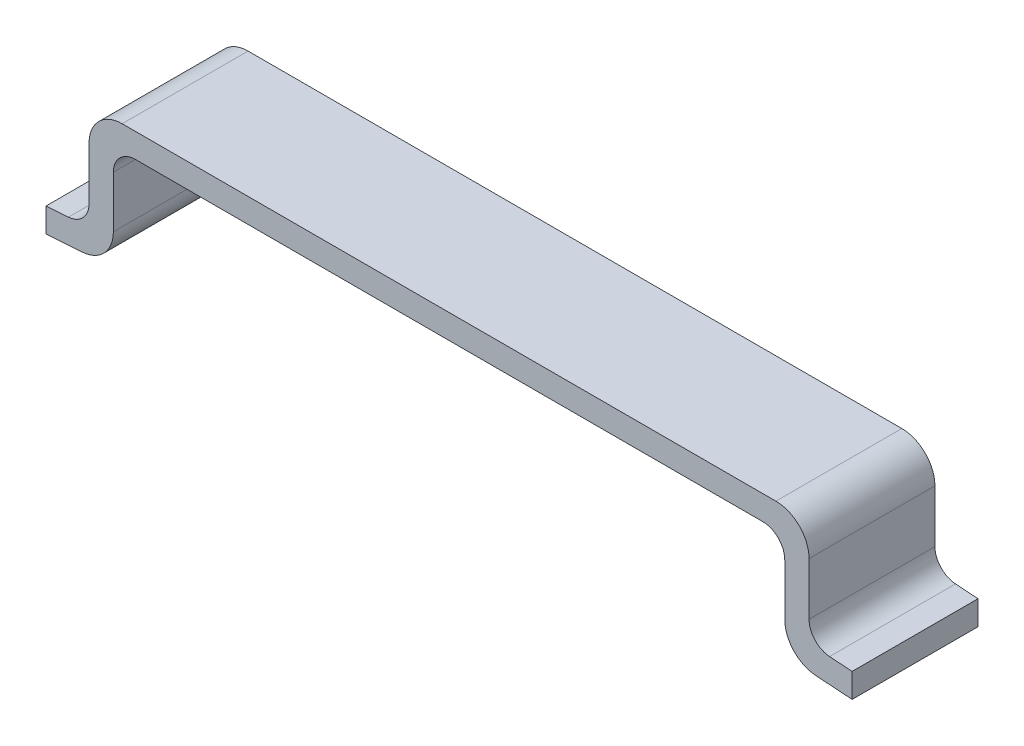
ISO-10303-21;
HEADER;
FILE_DESCRIPTION(('STEP AP214'),'2;1');
FILE_NAME('part.step','',(''),(''),'','','');
FILE_SCHEMA(('AUTOMOTIVE_DESIGN { 1 0 10303 214 1 1 1 1 }'));
ENDSEC;
DATA;
#1=APPLICATION_CONTEXT('core data for automotive mechanical design processes');
#2=APPLICATION_PROTOCOL_DEFINITION('international standard','automotive_design',2000,#1);
#3=PRODUCT_CONTEXT('',#1,'mechanical');
#4=PRODUCT('Part','Part','',(#3));
#5=PRODUCT_RELATED_PRODUCT_CATEGORY('part','',(#4));
#6=PRODUCT_DEFINITION_FORMATION('','',#4);
#7=PRODUCT_DEFINITION_CONTEXT('part definition',#1,'design');
#8=PRODUCT_DEFINITION('design','',#6,#7);
#9=PRODUCT_DEFINITION_SHAPE('','',#8);
#10=(LENGTH_UNIT() NAMED_UNIT(*) SI_UNIT(.MILLI.,.METRE.));
#11=(NAMED_UNIT(*) PLANE_ANGLE_UNIT() SI_UNIT($,.RADIAN.));
#12=(NAMED_UNIT(*) SI_UNIT($,.STERADIAN.) SOLID_ANGLE_UNIT());
#13=UNCERTAINTY_MEASURE_WITH_UNIT(LENGTH_MEASURE(1.E-05),#10,'distance_accuracy_value','');
#14=(GEOMETRIC_REPRESENTATION_CONTEXT(3) GLOBAL_UNCERTAINTY_ASSIGNED_CONTEXT((#13)) GLOBAL_UNIT_ASSIGNED_CONTEXT((#10,
#11,#12)) REPRESENTATION_CONTEXT('',''));
#15=CARTESIAN_POINT('',(0.,0.,0.));
#16=DIRECTION('',(0.,0.,1.));
#17=DIRECTION('',(1.,0.,0.));
#18=AXIS2_PLACEMENT_3D('',#15,#16,#17);
#19=CARTESIAN_POINT('',(1.825,0.,0.));
#20=DIRECTION('',(1.,0.,0.));
#21=DIRECTION('',(0.,1.,0.));
#22=AXIS2_PLACEMENT_3D('',#19,#20,#21);
#23=PLANE('',#22);
#24=DIRECTION('',(0.,0.,1.));
#25=VECTOR('',#24,1.);
#26=CARTESIAN_POINT('',(1.825,0.11,0.));
#27=LINE('',#26,#25);
#28=CARTESIAN_POINT('',(1.825,0.11,-0.285));
#29=VERTEX_POINT('',#28);
#30=CARTESIAN_POINT('',(1.825,0.11,0.285));
#31=VERTEX_POINT('',#30);
#32=EDGE_CURVE('E11',#29,#31,#27,.T.);
#33=ORIENTED_EDGE('',*,*,#32,.T.);
#34=DIRECTION('',(0.,1.,0.));
#35=VECTOR('',#34,1.);
#36=CARTESIAN_POINT('',(1.825,0.,0.285));
#37=LINE('',#36,#35);
#38=CARTESIAN_POINT('',(1.825,0.,0.285));
#39=VERTEX_POINT('',#38);
#40=EDGE_CURVE('E213',#39,#31,#37,.T.);
#41=ORIENTED_EDGE('',*,*,#40,.F.);
#42=DIRECTION('',(0.,0.,-1.));
#43=VECTOR('',#42,1.);
#44=CARTESIAN_POINT('',(1.825,0.,0.));
#45=LINE('',#44,#43);
#46=CARTESIAN_POINT('',(1.825,0.,-0.285));
#47=VERTEX_POINT('',#46);
#48=EDGE_CURVE('E186',#39,#47,#45,.T.);
#49=ORIENTED_EDGE('',*,*,#48,.T.);
#50=DIRECTION('',(0.,-1.,0.));
#51=VECTOR('',#50,1.);
#52=CARTESIAN_POINT('',(1.825,0.,-0.285));
#53=LINE('',#52,#51);
#54=EDGE_CURVE('E184',#29,#47,#53,.T.);
#55=ORIENTED_EDGE('',*,*,#54,.F.);
#56=EDGE_LOOP('',(#33,#41,#49,#55));
#57=FACE_BOUND('',#56,.T.);
#58=ADVANCED_FACE('F17',(#57),#23,.T.);
#59=CARTESIAN_POINT('',(1.825,0.11,0.));
#60=DIRECTION('',(0.0697564737441177,0.997564050259825,0.));
#61=DIRECTION('',(0.,0.,-1.));
#62=AXIS2_PLACEMENT_3D('',#59,#60,#61);
#63=PLANE('',#62);
#64=DIRECTION('',(0.,0.,-1.));
#65=VECTOR('',#64,1.);
#66=CARTESIAN_POINT('',(1.723024352626,0.117130831917,0.));
#67=LINE('',#66,#65);
#68=CARTESIAN_POINT('',(1.723024352626,0.117130831917,0.285));
#69=VERTEX_POINT('',#68);
#70=CARTESIAN_POINT('',(1.723024352626,0.117130831917,-0.285));
#71=VERTEX_POINT('',#70);
#72=EDGE_CURVE('E273',#69,#71,#67,.T.);
#73=ORIENTED_EDGE('',*,*,#72,.F.);
#74=DIRECTION('',(-0.997564050259825,0.0697564737441177,0.));
#75=VECTOR('',#74,1.);
#76=CARTESIAN_POINT('',(1.825,0.11,0.285));
#77=LINE('',#76,#75);
#78=EDGE_CURVE('E181',#31,#69,#77,.T.);
#79=ORIENTED_EDGE('',*,*,#78,.F.);
#80=ORIENTED_EDGE('',*,*,#32,.F.);
#81=DIRECTION('',(0.997564050259825,-0.0697564737441177,0.));
#82=VECTOR('',#81,1.);
#83=CARTESIAN_POINT('',(1.825,0.11,-0.285));
#84=LINE('',#83,#82);
#85=EDGE_CURVE('E179',#71,#29,#84,.T.);
#86=ORIENTED_EDGE('',*,*,#85,.F.);
#87=EDGE_LOOP('',(#73,#79,#80,#86));
#88=FACE_BOUND('',#87,.T.);
#89=ADVANCED_FACE('F19',(#88),#63,.T.);
#90=CARTESIAN_POINT('',(1.52,0.605,0.));
#91=DIRECTION('',(-1.,0.,0.));
#92=DIRECTION('',(0.,0.,1.));
#93=AXIS2_PLACEMENT_3D('',#90,#91,#92);
#94=PLANE('',#93);
#95=DIRECTION('',(0.,0.,1.));
#96=VECTOR('',#95,1.);
#97=CARTESIAN_POINT('',(1.52,0.395,0.));
#98=LINE('',#97,#96);
#99=CARTESIAN_POINT('',(1.52,0.395,-0.285));
#100=VERTEX_POINT('',#99);
#101=CARTESIAN_POINT('',(1.52,0.395,0.285));
#102=VERTEX_POINT('',#101);
#103=EDGE_CURVE('E248',#100,#102,#98,.T.);
#104=ORIENTED_EDGE('',*,*,#103,.F.);
#105=DIRECTION('',(0.,1.,0.));
#106=VECTOR('',#105,1.);
#107=CARTESIAN_POINT('',(1.52,0.605,-0.285));
#108=LINE('',#107,#106);
#109=CARTESIAN_POINT('',(1.52,0.161204940563,-0.285));
#110=VERTEX_POINT('',#109);
#111=EDGE_CURVE('E379',#110,#100,#108,.T.);
#112=ORIENTED_EDGE('',*,*,#111,.F.);
#113=DIRECTION('',(0.,0.,-1.));
#114=VECTOR('',#113,1.);
#115=CARTESIAN_POINT('',(1.52,0.161204940563,0.));
#116=LINE('',#115,#114);
#117=CARTESIAN_POINT('',(1.52,0.161204940563,0.285));
#118=VERTEX_POINT('',#117);
#119=EDGE_CURVE('E292',#118,#110,#116,.T.);
#120=ORIENTED_EDGE('',*,*,#119,.F.);
#121=DIRECTION('',(0.,-1.,0.));
#122=VECTOR('',#121,1.);
#123=CARTESIAN_POINT('',(1.52,0.605,0.285));
#124=LINE('',#123,#122);
#125=EDGE_CURVE('E27',#102,#118,#124,.T.);
#126=ORIENTED_EDGE('',*,*,#125,.F.);
#127=EDGE_LOOP('',(#104,#112,#120,#126));
#128=FACE_BOUND('',#127,.T.);
#129=ADVANCED_FACE('F747',(#128),#94,.T.);
#130=CARTESIAN_POINT('',(1.575,0.605,0.));
#131=DIRECTION('',(0.,1.,0.));
#132=DIRECTION('',(1.,0.,0.));
#133=AXIS2_PLACEMENT_3D('',#130,#131,#132);
#134=PLANE('',#133);
#135=DIRECTION('',(0.,0.,1.));
#136=VECTOR('',#135,1.);
#137=CARTESIAN_POINT('',(1.48,0.605,0.));
#138=LINE('',#137,#136);
#139=CARTESIAN_POINT('',(1.48,0.605,-0.285));
#140=VERTEX_POINT('',#139);
#141=CARTESIAN_POINT('',(1.48,0.605,0.285));
#142=VERTEX_POINT('',#141);
#143=EDGE_CURVE('E209',#140,#142,#138,.T.);
#144=ORIENTED_EDGE('',*,*,#143,.F.);
#145=DIRECTION('',(-1.,0.,0.));
#146=VECTOR('',#145,1.);
#147=CARTESIAN_POINT('',(-1.63,0.605,-0.285));
#148=LINE('',#147,#146);
#149=CARTESIAN_POINT('',(-1.48,0.605,-0.285));
#150=VERTEX_POINT('',#149);
#151=EDGE_CURVE('E205',#140,#150,#148,.T.);
#152=ORIENTED_EDGE('',*,*,#151,.T.);
#153=DIRECTION('',(0.,0.,1.));
#154=VECTOR('',#153,1.);
#155=CARTESIAN_POINT('',(-1.48,0.605,0.));
#156=LINE('',#155,#154);
#157=CARTESIAN_POINT('',(-1.48,0.605,0.285));
#158=VERTEX_POINT('',#157);
#159=EDGE_CURVE('E304',#150,#158,#156,.T.);
#160=ORIENTED_EDGE('',*,*,#159,.T.);
#161=DIRECTION('',(-1.,0.,0.));
#162=VECTOR('',#161,1.);
#163=CARTESIAN_POINT('',(1.63,0.605,0.285));
#164=LINE('',#163,#162);
#165=EDGE_CURVE('E216',#142,#158,#164,.T.);
#166=ORIENTED_EDGE('',*,*,#165,.F.);
#167=EDGE_LOOP('',(#144,#152,#160,#166));
#168=FACE_BOUND('',#167,.T.);
#169=ADVANCED_FACE('F386',(#168),#134,.T.);
#170=CARTESIAN_POINT('',(0.7875,0.55,0.285));
#171=DIRECTION('',(0.,0.,1.));
#172=DIRECTION('',(1.,0.,0.));
#173=AXIS2_PLACEMENT_3D('',#170,#171,#172);
#174=PLANE('',#173);
#175=CARTESIAN_POINT('',(1.67,0.161204940563,0.285));
#176=DIRECTION('',(0.,0.,-1.));
#177=DIRECTION('',(-0.73135370161934,-0.681998360062317,0.));
#178=AXIS2_PLACEMENT_3D('',#175,#176,#177);
#179=CIRCLE('',#178,0.15);
#180=CARTESIAN_POINT('',(1.659536528938,0.01157033302445,0.285));
#181=VERTEX_POINT('',#180);
#182=EDGE_CURVE('E288',#181,#118,#179,.T.);
#183=ORIENTED_EDGE('',*,*,#182,.F.);
#184=DIRECTION('',(0.997564050259825,-0.0697564737441177,0.));
#185=VECTOR('',#184,1.);
#186=CARTESIAN_POINT('',(1.52,0.02132767764277,0.285));
#187=LINE('',#186,#185);
#188=EDGE_CURVE('E375',#181,#39,#187,.T.);
#189=ORIENTED_EDGE('',*,*,#188,.T.);
#190=ORIENTED_EDGE('',*,*,#40,.T.);
#191=ORIENTED_EDGE('',*,*,#78,.T.);
#192=CARTESIAN_POINT('',(1.73,0.216887236943,0.285));
#193=DIRECTION('',(0.,0.,1.));
#194=DIRECTION('',(-0.73135370161934,-0.681998360062317,0.));
#195=AXIS2_PLACEMENT_3D('',#192,#193,#194);
#196=CIRCLE('',#195,0.1);
#197=CARTESIAN_POINT('',(1.63,0.216887236943,0.285));
#198=VERTEX_POINT('',#197);
#199=EDGE_CURVE('E277',#198,#69,#196,.T.);
#200=ORIENTED_EDGE('',*,*,#199,.F.);
#201=DIRECTION('',(0.,1.,0.));
#202=VECTOR('',#201,1.);
#203=CARTESIAN_POINT('',(1.63,0.123635728329,0.285));
#204=LINE('',#203,#202);
#205=CARTESIAN_POINT('',(1.63,0.455,0.285));
#206=VERTEX_POINT('',#205);
#207=EDGE_CURVE('E233',#198,#206,#204,.T.);
#208=ORIENTED_EDGE('',*,*,#207,.T.);
#209=CARTESIAN_POINT('',(1.48,0.455,0.285));
#210=DIRECTION('',(0.,0.,-1.));
#211=DIRECTION('',(0.707106781186548,0.707106781186548,0.));
#212=AXIS2_PLACEMENT_3D('',#209,#210,#211);
#213=CIRCLE('',#212,0.15);
#214=EDGE_CURVE('E190',#142,#206,#213,.T.);
#215=ORIENTED_EDGE('',*,*,#214,.F.);
#216=ORIENTED_EDGE('',*,*,#165,.T.);
#217=CARTESIAN_POINT('',(-1.48,0.455,0.285));
#218=DIRECTION('',(0.,0.,1.));
#219=DIRECTION('',(-0.707106781186548,0.707106781186548,0.));
#220=AXIS2_PLACEMENT_3D('',#217,#218,#219);
#221=CIRCLE('',#220,0.15);
#222=CARTESIAN_POINT('',(-1.63,0.455,0.285));
#223=VERTEX_POINT('',#222);
#224=EDGE_CURVE('E301',#158,#223,#221,.T.);
#225=ORIENTED_EDGE('',*,*,#224,.T.);
#226=DIRECTION('',(0.,1.,0.));
#227=VECTOR('',#226,1.);
#228=CARTESIAN_POINT('',(-1.63,0.123635728329,0.285));
#229=LINE('',#228,#227);
#230=CARTESIAN_POINT('',(-1.63,0.216887236943,0.285));
#231=VERTEX_POINT('',#230);
#232=EDGE_CURVE('E401',#231,#223,#229,.T.);
#233=ORIENTED_EDGE('',*,*,#232,.F.);
#234=CARTESIAN_POINT('',(-1.73,0.216887236943,0.285));
#235=DIRECTION('',(0.,0.,-1.));
#236=DIRECTION('',(0.73135370161934,-0.681998360062317,0.));
#237=AXIS2_PLACEMENT_3D('',#234,#235,#236);
#238=CIRCLE('',#237,0.1);
#239=CARTESIAN_POINT('',(-1.723024352626,0.117130831917,0.285));
#240=VERTEX_POINT('',#239);
#241=EDGE_CURVE('E405',#231,#240,#238,.T.);
#242=ORIENTED_EDGE('',*,*,#241,.T.);
#243=DIRECTION('',(0.997564050259825,0.0697564737441177,0.));
#244=VECTOR('',#243,1.);
#245=CARTESIAN_POINT('',(-1.825,0.11,0.285));
#246=LINE('',#245,#244);
#247=CARTESIAN_POINT('',(-1.825,0.11,0.285));
#248=VERTEX_POINT('',#247);
#249=EDGE_CURVE('E332',#248,#240,#246,.T.);
#250=ORIENTED_EDGE('',*,*,#249,.F.);
#251=DIRECTION('',(0.,1.,0.));
#252=VECTOR('',#251,1.);
#253=CARTESIAN_POINT('',(-1.825,0.,0.285));
#254=LINE('',#253,#252);
#255=CARTESIAN_POINT('',(-1.825,0.,0.285));
#256=VERTEX_POINT('',#255);
#257=EDGE_CURVE('E338',#256,#248,#254,.T.);
#258=ORIENTED_EDGE('',*,*,#257,.F.);
#259=DIRECTION('',(-0.997564050259825,-0.0697564737441177,0.));
#260=VECTOR('',#259,1.);
#261=CARTESIAN_POINT('',(-1.52,0.02132767764277,0.285));
#262=LINE('',#261,#260);
#263=CARTESIAN_POINT('',(-1.659536528938,0.01157033302445,0.285));
#264=VERTEX_POINT('',#263);
#265=EDGE_CURVE('E257',#264,#256,#262,.T.);
#266=ORIENTED_EDGE('',*,*,#265,.F.);
#267=CARTESIAN_POINT('',(-1.67,0.161204940563,0.285));
#268=DIRECTION('',(0.,0.,1.));
#269=DIRECTION('',(0.73135370161934,-0.681998360062317,0.));
#270=AXIS2_PLACEMENT_3D('',#267,#268,#269);
#271=CIRCLE('',#270,0.15);
#272=CARTESIAN_POINT('',(-1.52,0.161204940563,0.285));
#273=VERTEX_POINT('',#272);
#274=EDGE_CURVE('E263',#264,#273,#271,.T.);
#275=ORIENTED_EDGE('',*,*,#274,.T.);
#276=DIRECTION('',(0.,-1.,0.));
#277=VECTOR('',#276,1.);
#278=CARTESIAN_POINT('',(-1.52,0.605,0.285));
#279=LINE('',#278,#277);
#280=CARTESIAN_POINT('',(-1.52,0.395,0.285));
#281=VERTEX_POINT('',#280);
#282=EDGE_CURVE('E311',#281,#273,#279,.T.);
#283=ORIENTED_EDGE('',*,*,#282,.F.);
#284=CARTESIAN_POINT('',(-1.42,0.395,0.285));
#285=DIRECTION('',(0.,0.,-1.));
#286=DIRECTION('',(-0.707106781186548,0.707106781186548,0.));
#287=AXIS2_PLACEMENT_3D('',#284,#285,#286);
#288=CIRCLE('',#287,0.1);
#289=CARTESIAN_POINT('',(-1.42,0.495,0.285));
#290=VERTEX_POINT('',#289);
#291=EDGE_CURVE('E239',#281,#290,#288,.T.);
#292=ORIENTED_EDGE('',*,*,#291,.T.);
#293=DIRECTION('',(-1.,0.,0.));
#294=VECTOR('',#293,1.);
#295=CARTESIAN_POINT('',(0.,0.495,0.285));
#296=LINE('',#295,#294);
#297=CARTESIAN_POINT('',(1.42,0.495,0.285));
#298=VERTEX_POINT('',#297);
#299=EDGE_CURVE('E244',#298,#290,#296,.T.);
#300=ORIENTED_EDGE('',*,*,#299,.F.);
#301=CARTESIAN_POINT('',(1.42,0.395,0.285));
#302=DIRECTION('',(0.,0.,1.));
#303=DIRECTION('',(0.707106781186548,0.707106781186548,0.));
#304=AXIS2_PLACEMENT_3D('',#301,#302,#303);
#305=CIRCLE('',#304,0.1);
#306=EDGE_CURVE('E237',#102,#298,#305,.T.);
#307=ORIENTED_EDGE('',*,*,#306,.F.);
#308=ORIENTED_EDGE('',*,*,#125,.T.);
#309=EDGE_LOOP('',(#183,#189,#190,#191,#200,#208,#215,#216,#225,#233,#242,#250,#258,#266,#275,
#283,#292,#300,#307,#308));
#310=FACE_BOUND('',#309,.T.);
#311=ADVANCED_FACE('F399',(#310),#174,.T.);
#312=CARTESIAN_POINT('',(1.48,0.455,0.));
#313=DIRECTION('',(0.,0.,1.));
#314=DIRECTION('',(0.707106781186548,0.707106781186548,0.));
#315=AXIS2_PLACEMENT_3D('',#312,#313,#314);
#316=CYLINDRICAL_SURFACE('',#315,0.15);
#317=ORIENTED_EDGE('',*,*,#214,.T.);
#318=DIRECTION('',(0.,0.,-1.));
#319=VECTOR('',#318,1.);
#320=CARTESIAN_POINT('',(1.63,0.455,0.));
#321=LINE('',#320,#319);
#322=CARTESIAN_POINT('',(1.63,0.455,-0.285));
#323=VERTEX_POINT('',#322);
#324=EDGE_CURVE('E238',#206,#323,#321,.T.);
#325=ORIENTED_EDGE('',*,*,#324,.T.);
#326=CARTESIAN_POINT('',(1.48,0.455,-0.285));
#327=DIRECTION('',(0.,0.,1.));
#328=DIRECTION('',(0.707106781186548,0.707106781186548,0.));
#329=AXIS2_PLACEMENT_3D('',#326,#327,#328);
#330=CIRCLE('',#329,0.15);
#331=EDGE_CURVE('E198',#323,#140,#330,.T.);
#332=ORIENTED_EDGE('',*,*,#331,.T.);
#333=ORIENTED_EDGE('',*,*,#143,.T.);
#334=EDGE_LOOP('',(#317,#325,#332,#333));
#335=FACE_BOUND('',#334,.T.);
#336=ADVANCED_FACE('F701',(#335),#316,.T.);
#337=CARTESIAN_POINT('',(0.7875,0.55,-0.285));
#338=DIRECTION('',(0.,0.,-1.));
#339=DIRECTION('',(0.,-1.,0.));
#340=AXIS2_PLACEMENT_3D('',#337,#338,#339);
#341=PLANE('',#340);
#342=CARTESIAN_POINT('',(1.67,0.161204940563,-0.285));
#343=DIRECTION('',(0.,0.,1.));
#344=DIRECTION('',(-0.73135370161934,-0.681998360062317,0.));
#345=AXIS2_PLACEMENT_3D('',#342,#343,#344);
#346=CIRCLE('',#345,0.15);
#347=CARTESIAN_POINT('',(1.659536528938,0.01157033302445,-0.285));
#348=VERTEX_POINT('',#347);
#349=EDGE_CURVE('E324',#110,#348,#346,.T.);
#350=ORIENTED_EDGE('',*,*,#349,.F.);
#351=ORIENTED_EDGE('',*,*,#111,.T.);
#352=CARTESIAN_POINT('',(1.42,0.395,-0.285));
#353=DIRECTION('',(0.,0.,-1.));
#354=DIRECTION('',(0.707106781186548,0.707106781186548,0.));
#355=AXIS2_PLACEMENT_3D('',#352,#353,#354);
#356=CIRCLE('',#355,0.1);
#357=CARTESIAN_POINT('',(1.42,0.495,-0.285));
#358=VERTEX_POINT('',#357);
#359=EDGE_CURVE('E358',#358,#100,#356,.T.);
#360=ORIENTED_EDGE('',*,*,#359,.F.);
#361=DIRECTION('',(-1.,0.,0.));
#362=VECTOR('',#361,1.);
#363=CARTESIAN_POINT('',(0.,0.495,-0.285));
#364=LINE('',#363,#362);
#365=CARTESIAN_POINT('',(-1.42,0.495,-0.285));
#366=VERTEX_POINT('',#365);
#367=EDGE_CURVE('E247',#358,#366,#364,.T.);
#368=ORIENTED_EDGE('',*,*,#367,.T.);
#369=CARTESIAN_POINT('',(-1.42,0.395,-0.285));
#370=DIRECTION('',(0.,0.,1.));
#371=DIRECTION('',(-0.707106781186548,0.707106781186548,0.));
#372=AXIS2_PLACEMENT_3D('',#369,#370,#371);
#373=CIRCLE('',#372,0.1);
#374=CARTESIAN_POINT('',(-1.52,0.395,-0.285));
#375=VERTEX_POINT('',#374);
#376=EDGE_CURVE('E252',#366,#375,#373,.T.);
#377=ORIENTED_EDGE('',*,*,#376,.T.);
#378=DIRECTION('',(0.,1.,0.));
#379=VECTOR('',#378,1.);
#380=CARTESIAN_POINT('',(-1.52,0.605,-0.285));
#381=LINE('',#380,#379);
#382=CARTESIAN_POINT('',(-1.52,0.161204940563,-0.285));
#383=VERTEX_POINT('',#382);
#384=EDGE_CURVE('E314',#383,#375,#381,.T.);
#385=ORIENTED_EDGE('',*,*,#384,.F.);
#386=CARTESIAN_POINT('',(-1.67,0.161204940563,-0.285));
#387=DIRECTION('',(0.,0.,-1.));
#388=DIRECTION('',(0.73135370161934,-0.681998360062317,0.));
#389=AXIS2_PLACEMENT_3D('',#386,#387,#388);
#390=CIRCLE('',#389,0.15);
#391=CARTESIAN_POINT('',(-1.659536528938,0.01157033302445,-0.285));
#392=VERTEX_POINT('',#391);
#393=EDGE_CURVE('E258',#383,#392,#390,.T.);
#394=ORIENTED_EDGE('',*,*,#393,.T.);
#395=DIRECTION('',(0.997564050259825,0.0697564737441177,0.));
#396=VECTOR('',#395,1.);
#397=CARTESIAN_POINT('',(-1.52,0.02132767764277,-0.285));
#398=LINE('',#397,#396);
#399=CARTESIAN_POINT('',(-1.825,0.,-0.285));
#400=VERTEX_POINT('',#399);
#401=EDGE_CURVE('E297',#400,#392,#398,.T.);
#402=ORIENTED_EDGE('',*,*,#401,.F.);
#403=DIRECTION('',(0.,-1.,0.));
#404=VECTOR('',#403,1.);
#405=CARTESIAN_POINT('',(-1.825,0.,-0.285));
#406=LINE('',#405,#404);
#407=CARTESIAN_POINT('',(-1.825,0.11,-0.285));
#408=VERTEX_POINT('',#407);
#409=EDGE_CURVE('E335',#408,#400,#406,.T.);
#410=ORIENTED_EDGE('',*,*,#409,.F.);
#411=DIRECTION('',(-0.997564050259825,-0.0697564737441177,0.));
#412=VECTOR('',#411,1.);
#413=CARTESIAN_POINT('',(-1.825,0.11,-0.285));
#414=LINE('',#413,#412);
#415=CARTESIAN_POINT('',(-1.723024352626,0.117130831917,-0.285));
#416=VERTEX_POINT('',#415);
#417=EDGE_CURVE('E318',#416,#408,#414,.T.);
#418=ORIENTED_EDGE('',*,*,#417,.F.);
#419=CARTESIAN_POINT('',(-1.73,0.216887236943,-0.285));
#420=DIRECTION('',(0.,0.,1.));
#421=DIRECTION('',(0.73135370161934,-0.681998360062317,0.));
#422=AXIS2_PLACEMENT_3D('',#419,#420,#421);
#423=CIRCLE('',#422,0.1);
#424=CARTESIAN_POINT('',(-1.63,0.216887236943,-0.285));
#425=VERTEX_POINT('',#424);
#426=EDGE_CURVE('E425',#416,#425,#423,.T.);
#427=ORIENTED_EDGE('',*,*,#426,.T.);
#428=DIRECTION('',(0.,-1.,0.));
#429=VECTOR('',#428,1.);
#430=CARTESIAN_POINT('',(-1.63,0.123635728329,-0.285));
#431=LINE('',#430,#429);
#432=CARTESIAN_POINT('',(-1.63,0.455,-0.285));
#433=VERTEX_POINT('',#432);
#434=EDGE_CURVE('E231',#433,#425,#431,.T.);
#435=ORIENTED_EDGE('',*,*,#434,.F.);
#436=CARTESIAN_POINT('',(-1.48,0.455,-0.285));
#437=DIRECTION('',(0.,0.,-1.));
#438=DIRECTION('',(-0.707106781186548,0.707106781186548,0.));
#439=AXIS2_PLACEMENT_3D('',#436,#437,#438);
#440=CIRCLE('',#439,0.15);
#441=EDGE_CURVE('E307',#433,#150,#440,.T.);
#442=ORIENTED_EDGE('',*,*,#441,.T.);
#443=ORIENTED_EDGE('',*,*,#151,.F.);
#444=ORIENTED_EDGE('',*,*,#331,.F.);
#445=DIRECTION('',(0.,-1.,0.));
#446=VECTOR('',#445,1.);
#447=CARTESIAN_POINT('',(1.63,0.123635728329,-0.285));
#448=LINE('',#447,#446);
#449=CARTESIAN_POINT('',(1.63,0.216887236943,-0.285));
#450=VERTEX_POINT('',#449);
#451=EDGE_CURVE('E276',#323,#450,#448,.T.);
#452=ORIENTED_EDGE('',*,*,#451,.T.);
#453=CARTESIAN_POINT('',(1.73,0.216887236943,-0.285));
#454=DIRECTION('',(0.,0.,-1.));
#455=DIRECTION('',(-0.73135370161934,-0.681998360062317,0.));
#456=AXIS2_PLACEMENT_3D('',#453,#454,#455);
#457=CIRCLE('',#456,0.1);
#458=EDGE_CURVE('E196',#71,#450,#457,.T.);
#459=ORIENTED_EDGE('',*,*,#458,.F.);
#460=ORIENTED_EDGE('',*,*,#85,.T.);
#461=ORIENTED_EDGE('',*,*,#54,.T.);
#462=DIRECTION('',(-0.997564050259825,0.0697564737441177,0.));
#463=VECTOR('',#462,1.);
#464=CARTESIAN_POINT('',(1.52,0.02132767764277,-0.285));
#465=LINE('',#464,#463);
#466=EDGE_CURVE('E323',#47,#348,#465,.T.);
#467=ORIENTED_EDGE('',*,*,#466,.T.);
#468=EDGE_LOOP('',(#350,#351,#360,#368,#377,#385,#394,#402,#410,#418,#427,#435,#442,#443,#444,
#452,#459,#460,#461,#467));
#469=FACE_BOUND('',#468,.T.);
#470=ADVANCED_FACE('F194',(#469),#341,.T.);
#471=CARTESIAN_POINT('',(1.52,0.02132767764277,0.));
#472=DIRECTION('',(-0.0697564737441177,-0.997564050259825,0.));
#473=DIRECTION('',(-0.997564050259825,0.0697564737441177,0.));
#474=AXIS2_PLACEMENT_3D('',#471,#472,#473);
#475=PLANE('',#474);
#476=DIRECTION('',(0.,0.,1.));
#477=VECTOR('',#476,1.);
#478=CARTESIAN_POINT('',(1.659536528938,0.01157033302445,0.));
#479=LINE('',#478,#477);
#480=EDGE_CURVE('E319',#348,#181,#479,.T.);
#481=ORIENTED_EDGE('',*,*,#480,.F.);
#482=ORIENTED_EDGE('',*,*,#466,.F.);
#483=ORIENTED_EDGE('',*,*,#48,.F.);
#484=ORIENTED_EDGE('',*,*,#188,.F.);
#485=EDGE_LOOP('',(#481,#482,#483,#484));
#486=FACE_BOUND('',#485,.T.);
#487=ADVANCED_FACE('F677',(#486),#475,.T.);
#488=CARTESIAN_POINT('',(1.67,0.161204940563,0.));
#489=DIRECTION('',(0.,0.,1.));
#490=DIRECTION('',(-0.73135370161934,-0.681998360062317,0.));
#491=AXIS2_PLACEMENT_3D('',#488,#489,#490);
#492=CYLINDRICAL_SURFACE('',#491,0.15);
#493=ORIENTED_EDGE('',*,*,#182,.T.);
#494=ORIENTED_EDGE('',*,*,#119,.T.);
#495=ORIENTED_EDGE('',*,*,#349,.T.);
#496=ORIENTED_EDGE('',*,*,#480,.T.);
#497=EDGE_LOOP('',(#493,#494,#495,#496));
#498=FACE_BOUND('',#497,.T.);
#499=ADVANCED_FACE('F682',(#498),#492,.T.);
#500=CARTESIAN_POINT('',(0.,0.495,0.));
#501=DIRECTION('',(0.,-1.,0.));
#502=DIRECTION('',(0.,0.,-1.));
#503=AXIS2_PLACEMENT_3D('',#500,#501,#502);
#504=PLANE('',#503);
#505=DIRECTION('',(0.,0.,-1.));
#506=VECTOR('',#505,1.);
#507=CARTESIAN_POINT('',(1.42,0.495,0.));
#508=LINE('',#507,#506);
#509=EDGE_CURVE('E349',#298,#358,#508,.T.);
#510=ORIENTED_EDGE('',*,*,#509,.F.);
#511=ORIENTED_EDGE('',*,*,#299,.T.);
#512=DIRECTION('',(0.,0.,-1.));
#513=VECTOR('',#512,1.);
#514=CARTESIAN_POINT('',(-1.42,0.495,0.));
#515=LINE('',#514,#513);
#516=EDGE_CURVE('E259',#290,#366,#515,.T.);
#517=ORIENTED_EDGE('',*,*,#516,.T.);
#518=ORIENTED_EDGE('',*,*,#367,.F.);
#519=EDGE_LOOP('',(#510,#511,#517,#518));
#520=FACE_BOUND('',#519,.T.);
#521=ADVANCED_FACE('F709',(#520),#504,.T.);
#522=CARTESIAN_POINT('',(1.42,0.395,0.));
#523=DIRECTION('',(0.,0.,-1.));
#524=DIRECTION('',(0.707106781186548,0.707106781186548,0.));
#525=AXIS2_PLACEMENT_3D('',#522,#523,#524);
#526=CYLINDRICAL_SURFACE('',#525,0.1);
#527=ORIENTED_EDGE('',*,*,#306,.T.);
#528=ORIENTED_EDGE('',*,*,#509,.T.);
#529=ORIENTED_EDGE('',*,*,#359,.T.);
#530=ORIENTED_EDGE('',*,*,#103,.T.);
#531=EDGE_LOOP('',(#527,#528,#529,#530));
#532=FACE_BOUND('',#531,.T.);
#533=ADVANCED_FACE('F692',(#532),#526,.F.);
#534=CARTESIAN_POINT('',(1.63,0.123635728329,0.));
#535=DIRECTION('',(1.,0.,0.));
#536=DIRECTION('',(0.,1.,0.));
#537=AXIS2_PLACEMENT_3D('',#534,#535,#536);
#538=PLANE('',#537);
#539=DIRECTION('',(0.,0.,1.));
#540=VECTOR('',#539,1.);
#541=CARTESIAN_POINT('',(1.63,0.216887236943,0.));
#542=LINE('',#541,#540);
#543=EDGE_CURVE('E284',#450,#198,#542,.T.);
#544=ORIENTED_EDGE('',*,*,#543,.F.);
#545=ORIENTED_EDGE('',*,*,#451,.F.);
#546=ORIENTED_EDGE('',*,*,#324,.F.);
#547=ORIENTED_EDGE('',*,*,#207,.F.);
#548=EDGE_LOOP('',(#544,#545,#546,#547));
#549=FACE_BOUND('',#548,.T.);
#550=ADVANCED_FACE('F650',(#549),#538,.T.);
#551=CARTESIAN_POINT('',(1.73,0.216887236943,0.));
#552=DIRECTION('',(0.,0.,1.));
#553=DIRECTION('',(-0.73135370161934,-0.681998360062317,0.));
#554=AXIS2_PLACEMENT_3D('',#551,#552,#553);
#555=CYLINDRICAL_SURFACE('',#554,0.1);
#556=ORIENTED_EDGE('',*,*,#458,.T.);
#557=ORIENTED_EDGE('',*,*,#543,.T.);
#558=ORIENTED_EDGE('',*,*,#199,.T.);
#559=ORIENTED_EDGE('',*,*,#72,.T.);
#560=EDGE_LOOP('',(#556,#557,#558,#559));
#561=FACE_BOUND('',#560,.T.);
#562=ADVANCED_FACE('F640',(#561),#555,.F.);
#563=CARTESIAN_POINT('',(-1.825,0.,0.));
#564=DIRECTION('',(1.,0.,0.));
#565=DIRECTION('',(0.,1.,0.));
#566=AXIS2_PLACEMENT_3D('',#563,#564,#565);
#567=PLANE('',#566);
#568=DIRECTION('',(0.,0.,1.));
#569=VECTOR('',#568,1.);
#570=CARTESIAN_POINT('',(-1.825,0.11,0.));
#571=LINE('',#570,#569);
#572=EDGE_CURVE('E328',#408,#248,#571,.T.);
#573=ORIENTED_EDGE('',*,*,#572,.F.);
#574=ORIENTED_EDGE('',*,*,#409,.T.);
#575=DIRECTION('',(0.,0.,-1.));
#576=VECTOR('',#575,1.);
#577=CARTESIAN_POINT('',(-1.825,0.,0.));
#578=LINE('',#577,#576);
#579=EDGE_CURVE('E293',#256,#400,#578,.T.);
#580=ORIENTED_EDGE('',*,*,#579,.F.);
#581=ORIENTED_EDGE('',*,*,#257,.T.);
#582=EDGE_LOOP('',(#573,#574,#580,#581));
#583=FACE_BOUND('',#582,.T.);
#584=ADVANCED_FACE('F634',(#583),#567,.F.);
#585=CARTESIAN_POINT('',(-1.825,0.11,0.));
#586=DIRECTION('',(0.0697564737441177,-0.997564050259825,0.));
#587=DIRECTION('',(0.,0.,-1.));
#588=AXIS2_PLACEMENT_3D('',#585,#586,#587);
#589=PLANE('',#588);
#590=DIRECTION('',(0.,0.,-1.));
#591=VECTOR('',#590,1.);
#592=CARTESIAN_POINT('',(-1.723024352626,0.117130831917,0.));
#593=LINE('',#592,#591);
#594=EDGE_CURVE('E419',#240,#416,#593,.T.);
#595=ORIENTED_EDGE('',*,*,#594,.T.);
#596=ORIENTED_EDGE('',*,*,#417,.T.);
#597=ORIENTED_EDGE('',*,*,#572,.T.);
#598=ORIENTED_EDGE('',*,*,#249,.T.);
#599=EDGE_LOOP('',(#595,#596,#597,#598));
#600=FACE_BOUND('',#599,.T.);
#601=ADVANCED_FACE('F639',(#600),#589,.F.);
#602=CARTESIAN_POINT('',(-1.52,0.605,0.));
#603=DIRECTION('',(-1.,0.,0.));
#604=DIRECTION('',(0.,0.,1.));
#605=AXIS2_PLACEMENT_3D('',#602,#603,#604);
#606=PLANE('',#605);
#607=DIRECTION('',(0.,0.,1.));
#608=VECTOR('',#607,1.);
#609=CARTESIAN_POINT('',(-1.52,0.395,0.));
#610=LINE('',#609,#608);
#611=EDGE_CURVE('E243',#375,#281,#610,.T.);
#612=ORIENTED_EDGE('',*,*,#611,.T.);
#613=ORIENTED_EDGE('',*,*,#282,.T.);
#614=DIRECTION('',(0.,0.,-1.));
#615=VECTOR('',#614,1.);
#616=CARTESIAN_POINT('',(-1.52,0.161204940563,0.));
#617=LINE('',#616,#615);
#618=EDGE_CURVE('E253',#273,#383,#617,.T.);
#619=ORIENTED_EDGE('',*,*,#618,.T.);
#620=ORIENTED_EDGE('',*,*,#384,.T.);
#621=EDGE_LOOP('',(#612,#613,#619,#620));
#622=FACE_BOUND('',#621,.T.);
#623=ADVANCED_FACE('F629',(#622),#606,.F.);
#624=CARTESIAN_POINT('',(-1.48,0.455,0.));
#625=DIRECTION('',(0.,0.,-1.));
#626=DIRECTION('',(-0.707106781186548,0.707106781186548,0.));
#627=AXIS2_PLACEMENT_3D('',#624,#625,#626);
#628=CYLINDRICAL_SURFACE('',#627,0.15);
#629=ORIENTED_EDGE('',*,*,#224,.F.);
#630=ORIENTED_EDGE('',*,*,#159,.F.);
#631=ORIENTED_EDGE('',*,*,#441,.F.);
#632=DIRECTION('',(0.,0.,-1.));
#633=VECTOR('',#632,1.);
#634=CARTESIAN_POINT('',(-1.63,0.455,0.));
#635=LINE('',#634,#633);
#636=EDGE_CURVE('E396',#223,#433,#635,.T.);
#637=ORIENTED_EDGE('',*,*,#636,.F.);
#638=EDGE_LOOP('',(#629,#630,#631,#637));
#639=FACE_BOUND('',#638,.T.);
#640=ADVANCED_FACE('F395',(#639),#628,.T.);
#641=CARTESIAN_POINT('',(-1.52,0.02132767764277,0.));
#642=DIRECTION('',(-0.0697564737441177,0.997564050259825,0.));
#643=DIRECTION('',(0.,0.,1.));
#644=AXIS2_PLACEMENT_3D('',#641,#642,#643);
#645=PLANE('',#644);
#646=DIRECTION('',(0.,0.,1.));
#647=VECTOR('',#646,1.);
#648=CARTESIAN_POINT('',(-1.659536528938,0.01157033302445,0.));
#649=LINE('',#648,#647);
#650=EDGE_CURVE('E272',#392,#264,#649,.T.);
#651=ORIENTED_EDGE('',*,*,#650,.T.);
#652=ORIENTED_EDGE('',*,*,#265,.T.);
#653=ORIENTED_EDGE('',*,*,#579,.T.);
#654=ORIENTED_EDGE('',*,*,#401,.T.);
#655=EDGE_LOOP('',(#651,#652,#653,#654));
#656=FACE_BOUND('',#655,.T.);
#657=ADVANCED_FACE('F619',(#656),#645,.F.);
#658=CARTESIAN_POINT('',(-1.67,0.161204940563,0.));
#659=DIRECTION('',(0.,0.,-1.));
#660=DIRECTION('',(0.73135370161934,-0.681998360062317,0.));
#661=AXIS2_PLACEMENT_3D('',#658,#659,#660);
#662=CYLINDRICAL_SURFACE('',#661,0.15);
#663=ORIENTED_EDGE('',*,*,#274,.F.);
#664=ORIENTED_EDGE('',*,*,#650,.F.);
#665=ORIENTED_EDGE('',*,*,#393,.F.);
#666=ORIENTED_EDGE('',*,*,#618,.F.);
#667=EDGE_LOOP('',(#663,#664,#665,#666));
#668=FACE_BOUND('',#667,.T.);
#669=ADVANCED_FACE('F610',(#668),#662,.T.);
#670=CARTESIAN_POINT('',(-1.42,0.395,0.));
#671=DIRECTION('',(0.,0.,1.));
#672=DIRECTION('',(-0.707106781186548,0.707106781186548,0.));
#673=AXIS2_PLACEMENT_3D('',#670,#671,#672);
#674=CYLINDRICAL_SURFACE('',#673,0.1);
#675=ORIENTED_EDGE('',*,*,#291,.F.);
#676=ORIENTED_EDGE('',*,*,#611,.F.);
#677=ORIENTED_EDGE('',*,*,#376,.F.);
#678=ORIENTED_EDGE('',*,*,#516,.F.);
#679=EDGE_LOOP('',(#675,#676,#677,#678));
#680=FACE_BOUND('',#679,.T.);
#681=ADVANCED_FACE('F602',(#680),#674,.F.);
#682=CARTESIAN_POINT('',(-1.63,0.123635728329,0.));
#683=DIRECTION('',(1.,0.,0.));
#684=DIRECTION('',(0.,1.,0.));
#685=AXIS2_PLACEMENT_3D('',#682,#683,#684);
#686=PLANE('',#685);
#687=DIRECTION('',(0.,0.,1.));
#688=VECTOR('',#687,1.);
#689=CARTESIAN_POINT('',(-1.63,0.216887236943,0.));
#690=LINE('',#689,#688);
#691=EDGE_CURVE('E409',#425,#231,#690,.T.);
#692=ORIENTED_EDGE('',*,*,#691,.T.);
#693=ORIENTED_EDGE('',*,*,#232,.T.);
#694=ORIENTED_EDGE('',*,*,#636,.T.);
#695=ORIENTED_EDGE('',*,*,#434,.T.);
#696=EDGE_LOOP('',(#692,#693,#694,#695));
#697=FACE_BOUND('',#696,.T.);
#698=ADVANCED_FACE('F412',(#697),#686,.F.);
#699=CARTESIAN_POINT('',(-1.73,0.216887236943,0.));
#700=DIRECTION('',(0.,0.,-1.));
#701=DIRECTION('',(0.73135370161934,-0.681998360062317,0.));
#702=AXIS2_PLACEMENT_3D('',#699,#700,#701);
#703=CYLINDRICAL_SURFACE('',#702,0.1);
#704=ORIENTED_EDGE('',*,*,#426,.F.);
#705=ORIENTED_EDGE('',*,*,#594,.F.);
#706=ORIENTED_EDGE('',*,*,#241,.F.);
#707=ORIENTED_EDGE('',*,*,#691,.F.);
#708=EDGE_LOOP('',(#704,#705,#706,#707));
#709=FACE_BOUND('',#708,.T.);
#710=ADVANCED_FACE('F417',(#709),#703,.F.);
#711=CLOSED_SHELL('',(#58,#89,#129,#169,#311,#336,#470,#487,#499,#521,#533,#550,#562,#584,#601,
#623,#640,#657,#669,#681,#698,#710));
#712=MANIFOLD_SOLID_BREP('B1',#711);
#713=ADVANCED_BREP_SHAPE_REPRESENTATION('',(#18,#712),#14);
#714=SHAPE_DEFINITION_REPRESENTATION(#9,#713);
ENDSEC;
END-ISO-10303-21;
